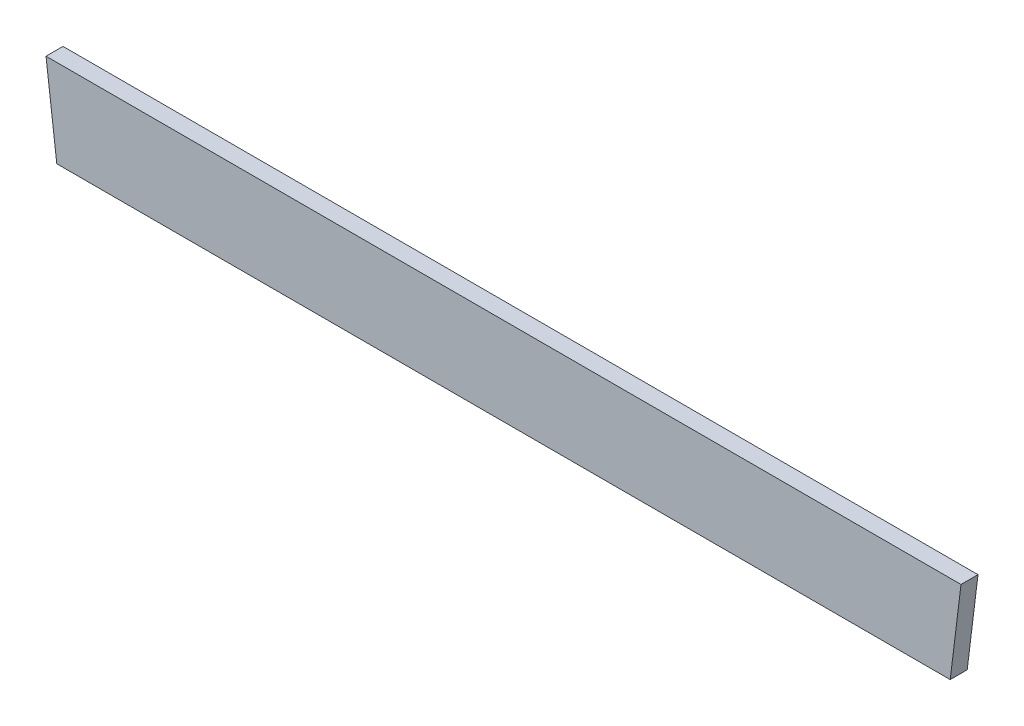
ISO-10303-21;
HEADER;
FILE_DESCRIPTION(('STEP AP214'),'2;1');
FILE_NAME('part.step','',(''),(''),'','','');
FILE_SCHEMA(('AUTOMOTIVE_DESIGN { 1 0 10303 214 1 1 1 1 }'));
ENDSEC;
DATA;
#1=APPLICATION_CONTEXT('core data for automotive mechanical design processes');
#2=APPLICATION_PROTOCOL_DEFINITION('international standard','automotive_design',2000,#1);
#3=PRODUCT_CONTEXT('',#1,'mechanical');
#4=PRODUCT('Part','Part','',(#3));
#5=PRODUCT_RELATED_PRODUCT_CATEGORY('part','',(#4));
#6=PRODUCT_DEFINITION_FORMATION('','',#4);
#7=PRODUCT_DEFINITION_CONTEXT('part definition',#1,'design');
#8=PRODUCT_DEFINITION('design','',#6,#7);
#9=PRODUCT_DEFINITION_SHAPE('','',#8);
#10=(LENGTH_UNIT() NAMED_UNIT(*) SI_UNIT(.MILLI.,.METRE.));
#11=(NAMED_UNIT(*) PLANE_ANGLE_UNIT() SI_UNIT($,.RADIAN.));
#12=(NAMED_UNIT(*) SI_UNIT($,.STERADIAN.) SOLID_ANGLE_UNIT());
#13=UNCERTAINTY_MEASURE_WITH_UNIT(LENGTH_MEASURE(1.E-05),#10,'distance_accuracy_value','');
#14=(GEOMETRIC_REPRESENTATION_CONTEXT(3) GLOBAL_UNCERTAINTY_ASSIGNED_CONTEXT((#13)) GLOBAL_UNIT_ASSIGNED_CONTEXT((#10,
#11,#12)) REPRESENTATION_CONTEXT('',''));
#15=CARTESIAN_POINT('',(0.,0.,0.));
#16=DIRECTION('',(0.,0.,1.));
#17=DIRECTION('',(1.,0.,0.));
#18=AXIS2_PLACEMENT_3D('',#15,#16,#17);
#19=CARTESIAN_POINT('',(269.175368733163,-62.6398926095214,10.));
#20=DIRECTION('',(0.,-1.,0.));
#21=DIRECTION('',(1.,0.,0.));
#22=AXIS2_PLACEMENT_3D('',#19,#20,#21);
#23=PLANE('',#22);
#24=DIRECTION('',(-1.,0.,0.));
#25=VECTOR('',#24,1.);
#26=CARTESIAN_POINT('',(269.175368733163,-62.6398926095214,0.));
#27=LINE('',#26,#25);
#28=CARTESIAN_POINT('',(269.175368733163,-62.6398926095214,0.));
#29=VERTEX_POINT('',#28);
#30=CARTESIAN_POINT('',(-269.175368733163,-62.6398926095214,0.));
#31=VERTEX_POINT('',#30);
#32=EDGE_CURVE('E95',#29,#31,#27,.T.);
#33=ORIENTED_EDGE('',*,*,#32,.T.);
#34=DIRECTION('',(0.,0.,-1.));
#35=VECTOR('',#34,1.);
#36=CARTESIAN_POINT('',(-269.175368733163,-62.6398926095214,10.));
#37=LINE('',#36,#35);
#38=CARTESIAN_POINT('',(-269.175368733163,-62.6398926095214,10.));
#39=VERTEX_POINT('',#38);
#40=EDGE_CURVE('E11',#39,#31,#37,.T.);
#41=ORIENTED_EDGE('',*,*,#40,.F.);
#42=DIRECTION('',(-1.,0.,0.));
#43=VECTOR('',#42,1.);
#44=CARTESIAN_POINT('',(269.175368733163,-62.6398926095214,10.));
#45=LINE('',#44,#43);
#46=CARTESIAN_POINT('',(269.175368733163,-62.6398926095214,10.));
#47=VERTEX_POINT('',#46);
#48=EDGE_CURVE('E83',#47,#39,#45,.T.);
#49=ORIENTED_EDGE('',*,*,#48,.F.);
#50=DIRECTION('',(0.,0.,-1.));
#51=VECTOR('',#50,1.);
#52=CARTESIAN_POINT('',(269.175368733163,-62.6398926095214,10.));
#53=LINE('',#52,#51);
#54=EDGE_CURVE('E91',#47,#29,#53,.T.);
#55=ORIENTED_EDGE('',*,*,#54,.T.);
#56=EDGE_LOOP('',(#33,#41,#49,#55));
#57=FACE_BOUND('',#56,.T.);
#58=ADVANCED_FACE('F32',(#57),#23,.F.);
#59=CARTESIAN_POINT('',(-269.175368733163,-62.6398926095214,10.));
#60=DIRECTION('',(0.992546151641322,0.121869343405147,0.));
#61=DIRECTION('',(-0.121869343405147,0.992546151641322,0.));
#62=AXIS2_PLACEMENT_3D('',#59,#60,#61);
#63=PLANE('',#62);
#64=DIRECTION('',(0.121869343405147,-0.992546151641322,0.));
#65=VECTOR('',#64,1.);
#66=CARTESIAN_POINT('',(-269.175368733163,-62.6398926095214,0.));
#67=LINE('',#66,#65);
#68=CARTESIAN_POINT('',(-262.832305131026,-114.3,0.));
#69=VERTEX_POINT('',#68);
#70=EDGE_CURVE('E87',#31,#69,#67,.T.);
#71=ORIENTED_EDGE('',*,*,#70,.T.);
#72=DIRECTION('',(0.,0.,-1.));
#73=VECTOR('',#72,1.);
#74=CARTESIAN_POINT('',(-262.832305131026,-114.3,10.));
#75=LINE('',#74,#73);
#76=CARTESIAN_POINT('',(-262.832305131026,-114.3,10.));
#77=VERTEX_POINT('',#76);
#78=EDGE_CURVE('E40',#77,#69,#75,.T.);
#79=ORIENTED_EDGE('',*,*,#78,.F.);
#80=DIRECTION('',(0.121869343405147,-0.992546151641322,0.));
#81=VECTOR('',#80,1.);
#82=CARTESIAN_POINT('',(-269.175368733163,-62.6398926095214,10.));
#83=LINE('',#82,#81);
#84=EDGE_CURVE('E78',#39,#77,#83,.T.);
#85=ORIENTED_EDGE('',*,*,#84,.F.);
#86=ORIENTED_EDGE('',*,*,#40,.T.);
#87=EDGE_LOOP('',(#71,#79,#85,#86));
#88=FACE_BOUND('',#87,.T.);
#89=ADVANCED_FACE('F86',(#88),#63,.F.);
#90=CARTESIAN_POINT('',(-262.832305131026,-114.3,10.));
#91=DIRECTION('',(0.,1.,0.));
#92=DIRECTION('',(0.,0.,1.));
#93=AXIS2_PLACEMENT_3D('',#90,#91,#92);
#94=PLANE('',#93);
#95=DIRECTION('',(1.,0.,0.));
#96=VECTOR('',#95,1.);
#97=CARTESIAN_POINT('',(-262.832305131026,-114.3,0.));
#98=LINE('',#97,#96);
#99=CARTESIAN_POINT('',(262.832305131026,-114.3,0.));
#100=VERTEX_POINT('',#99);
#101=EDGE_CURVE('E65',#69,#100,#98,.T.);
#102=ORIENTED_EDGE('',*,*,#101,.T.);
#103=DIRECTION('',(0.,0.,-1.));
#104=VECTOR('',#103,1.);
#105=CARTESIAN_POINT('',(262.832305131026,-114.3,10.));
#106=LINE('',#105,#104);
#107=CARTESIAN_POINT('',(262.832305131026,-114.3,10.));
#108=VERTEX_POINT('',#107);
#109=EDGE_CURVE('E88',#108,#100,#106,.T.);
#110=ORIENTED_EDGE('',*,*,#109,.F.);
#111=DIRECTION('',(1.,0.,0.));
#112=VECTOR('',#111,1.);
#113=CARTESIAN_POINT('',(-262.832305131026,-114.3,10.));
#114=LINE('',#113,#112);
#115=EDGE_CURVE('E81',#77,#108,#114,.T.);
#116=ORIENTED_EDGE('',*,*,#115,.F.);
#117=ORIENTED_EDGE('',*,*,#78,.T.);
#118=EDGE_LOOP('',(#102,#110,#116,#117));
#119=FACE_BOUND('',#118,.T.);
#120=ADVANCED_FACE('F89',(#119),#94,.F.);
#121=CARTESIAN_POINT('',(269.175368733163,-62.6398926095214,10.));
#122=DIRECTION('',(-0.992546151641322,0.121869343405148,0.));
#123=DIRECTION('',(-0.121869343405148,-0.992546151641322,0.));
#124=AXIS2_PLACEMENT_3D('',#121,#122,#123);
#125=PLANE('',#124);
#126=DIRECTION('',(0.121869343405148,0.992546151641322,0.));
#127=VECTOR('',#126,1.);
#128=CARTESIAN_POINT('',(269.175368733163,-62.6398926095214,0.));
#129=LINE('',#128,#127);
#130=EDGE_CURVE('E71',#100,#29,#129,.T.);
#131=ORIENTED_EDGE('',*,*,#130,.T.);
#132=ORIENTED_EDGE('',*,*,#54,.F.);
#133=DIRECTION('',(0.121869343405148,0.992546151641322,0.));
#134=VECTOR('',#133,1.);
#135=CARTESIAN_POINT('',(269.175368733163,-62.6398926095214,10.));
#136=LINE('',#135,#134);
#137=EDGE_CURVE('E48',#108,#47,#136,.T.);
#138=ORIENTED_EDGE('',*,*,#137,.F.);
#139=ORIENTED_EDGE('',*,*,#109,.T.);
#140=EDGE_LOOP('',(#131,#132,#138,#139));
#141=FACE_BOUND('',#140,.T.);
#142=ADVANCED_FACE('F102',(#141),#125,.F.);
#143=CARTESIAN_POINT('',(0.,0.,10.));
#144=DIRECTION('',(0.,0.,1.));
#145=DIRECTION('',(1.,0.,0.));
#146=AXIS2_PLACEMENT_3D('',#143,#144,#145);
#147=PLANE('',#146);
#148=ORIENTED_EDGE('',*,*,#48,.T.);
#149=ORIENTED_EDGE('',*,*,#84,.T.);
#150=ORIENTED_EDGE('',*,*,#115,.T.);
#151=ORIENTED_EDGE('',*,*,#137,.T.);
#152=EDGE_LOOP('',(#148,#149,#150,#151));
#153=FACE_BOUND('',#152,.T.);
#154=ADVANCED_FACE('F79',(#153),#147,.T.);
#155=CARTESIAN_POINT('',(0.,0.,0.));
#156=DIRECTION('',(0.,0.,1.));
#157=DIRECTION('',(1.,0.,0.));
#158=AXIS2_PLACEMENT_3D('',#155,#156,#157);
#159=PLANE('',#158);
#160=ORIENTED_EDGE('',*,*,#32,.F.);
#161=ORIENTED_EDGE('',*,*,#130,.F.);
#162=ORIENTED_EDGE('',*,*,#101,.F.);
#163=ORIENTED_EDGE('',*,*,#70,.F.);
#164=EDGE_LOOP('',(#160,#161,#162,#163));
#165=FACE_BOUND('',#164,.T.);
#166=ADVANCED_FACE('F105',(#165),#159,.F.);
#167=CLOSED_SHELL('',(#58,#89,#120,#142,#154,#166));
#168=MANIFOLD_SOLID_BREP('B2',#167);
#169=ADVANCED_BREP_SHAPE_REPRESENTATION('',(#18,#168),#14);
#170=SHAPE_DEFINITION_REPRESENTATION(#9,#169);
ENDSEC;
END-ISO-10303-21;
